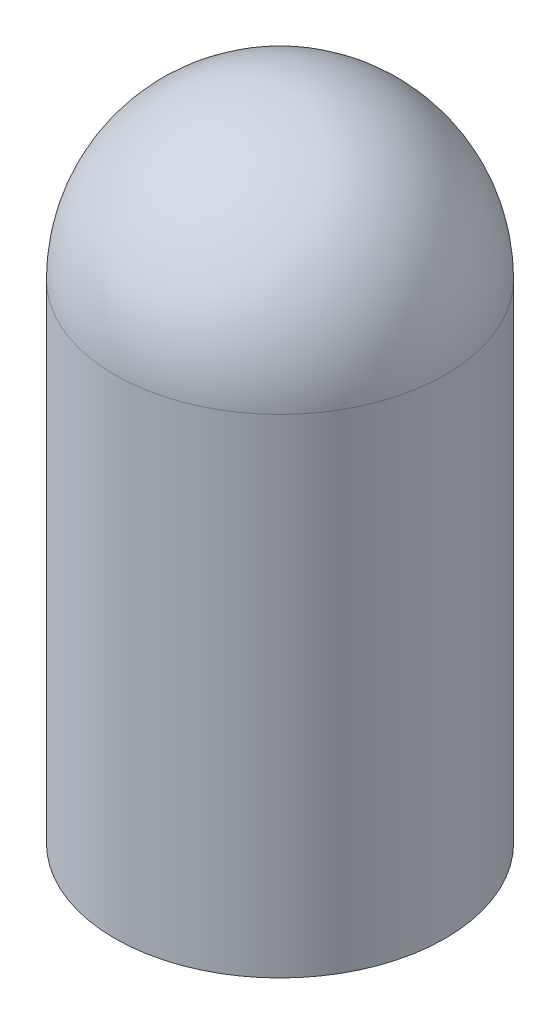
ISO-10303-21;
HEADER;
FILE_DESCRIPTION(('STEP AP214'),'2;1');
FILE_NAME('part.step','',(''),(''),'','','');
FILE_SCHEMA(('AUTOMOTIVE_DESIGN { 1 0 10303 214 1 1 1 1 }'));
ENDSEC;
DATA;
#1=APPLICATION_CONTEXT('core data for automotive mechanical design processes');
#2=APPLICATION_PROTOCOL_DEFINITION('international standard','automotive_design',2000,#1);
#3=PRODUCT_CONTEXT('',#1,'mechanical');
#4=PRODUCT('Part','Part','',(#3));
#5=PRODUCT_RELATED_PRODUCT_CATEGORY('part','',(#4));
#6=PRODUCT_DEFINITION_FORMATION('','',#4);
#7=PRODUCT_DEFINITION_CONTEXT('part definition',#1,'design');
#8=PRODUCT_DEFINITION('design','',#6,#7);
#9=PRODUCT_DEFINITION_SHAPE('','',#8);
#10=(LENGTH_UNIT() NAMED_UNIT(*) SI_UNIT(.MILLI.,.METRE.));
#11=(NAMED_UNIT(*) PLANE_ANGLE_UNIT() SI_UNIT($,.RADIAN.));
#12=(NAMED_UNIT(*) SI_UNIT($,.STERADIAN.) SOLID_ANGLE_UNIT());
#13=UNCERTAINTY_MEASURE_WITH_UNIT(LENGTH_MEASURE(1.E-05),#10,'distance_accuracy_value','');
#14=(GEOMETRIC_REPRESENTATION_CONTEXT(3) GLOBAL_UNCERTAINTY_ASSIGNED_CONTEXT((#13)) GLOBAL_UNIT_ASSIGNED_CONTEXT((#10,
#11,#12)) REPRESENTATION_CONTEXT('',''));
#15=CARTESIAN_POINT('',(0.,0.,0.));
#16=DIRECTION('',(0.,0.,1.));
#17=DIRECTION('',(1.,0.,0.));
#18=AXIS2_PLACEMENT_3D('',#15,#16,#17);
#19=CARTESIAN_POINT('',(-50.7999999999999,111.397142857143,0.));
#20=DIRECTION('',(0.,1.,0.));
#21=DIRECTION('',(-1.,0.,0.));
#22=AXIS2_PLACEMENT_3D('',#19,#20,#21);
#23=SPHERICAL_SURFACE('',#22,55.88);
#24=CARTESIAN_POINT('',(-50.7999999999999,111.397142857143,0.));
#25=DIRECTION('',(0.,1.,0.));
#26=DIRECTION('',(-1.,0.,0.));
#27=AXIS2_PLACEMENT_3D('',#24,#25,#26);
#28=CIRCLE('',#27,55.88);
#29=CARTESIAN_POINT('',(-106.68,111.397142857143,0.));
#30=VERTEX_POINT('',#29);
#31=EDGE_CURVE('E10',#30,#30,#28,.T.);
#32=ORIENTED_EDGE('',*,*,#31,.T.);
#33=EDGE_LOOP('',(#32));
#34=FACE_BOUND('',#33,.T.);
#35=ADVANCED_FACE('F33',(#34),#23,.T.);
#36=CARTESIAN_POINT('',(-50.7999999999999,162.197142857143,0.));
#37=DIRECTION('',(0.,1.,0.));
#38=DIRECTION('',(-1.,0.,0.));
#39=AXIS2_PLACEMENT_3D('',#36,#37,#38);
#40=CYLINDRICAL_SURFACE('',#39,55.88);
#41=CARTESIAN_POINT('',(-50.7999999999999,-53.7028571428571,0.));
#42=DIRECTION('',(0.,1.,0.));
#43=DIRECTION('',(-1.,0.,0.));
#44=AXIS2_PLACEMENT_3D('',#41,#42,#43);
#45=CIRCLE('',#44,55.88);
#46=CARTESIAN_POINT('',(-106.68,-53.7028571428571,0.));
#47=VERTEX_POINT('',#46);
#48=EDGE_CURVE('E37',#47,#47,#45,.T.);
#49=ORIENTED_EDGE('',*,*,#48,.T.);
#50=EDGE_LOOP('',(#49));
#51=FACE_BOUND('',#50,.T.);
#52=ORIENTED_EDGE('',*,*,#31,.F.);
#53=EDGE_LOOP('',(#52));
#54=FACE_BOUND('',#53,.T.);
#55=ADVANCED_FACE('F35',(#51,#54),#40,.T.);
#56=CARTESIAN_POINT('',(0.,-53.7028571428571,0.));
#57=DIRECTION('',(0.,1.,0.));
#58=DIRECTION('',(-1.,0.,0.));
#59=AXIS2_PLACEMENT_3D('',#56,#57,#58);
#60=PLANE('',#59);
#61=CARTESIAN_POINT('',(-50.7999999999999,-53.7028571428571,0.));
#62=DIRECTION('',(0.,1.,0.));
#63=DIRECTION('',(-1.,0.,0.));
#64=AXIS2_PLACEMENT_3D('',#61,#62,#63);
#65=CIRCLE('',#64,50.8);
#66=CARTESIAN_POINT('',(-101.6,-53.7028571428571,0.));
#67=VERTEX_POINT('',#66);
#68=EDGE_CURVE('E48',#67,#67,#65,.T.);
#69=ORIENTED_EDGE('',*,*,#68,.T.);
#70=EDGE_LOOP('',(#69));
#71=FACE_BOUND('',#70,.T.);
#72=ORIENTED_EDGE('',*,*,#48,.F.);
#73=EDGE_LOOP('',(#72));
#74=FACE_BOUND('',#73,.T.);
#75=ADVANCED_FACE('F52',(#71,#74),#60,.F.);
#76=CARTESIAN_POINT('',(-50.7999999999999,111.397142857143,0.));
#77=DIRECTION('',(0.,1.,0.));
#78=DIRECTION('',(-1.,0.,0.));
#79=AXIS2_PLACEMENT_3D('',#76,#77,#78);
#80=SPHERICAL_SURFACE('',#79,50.8);
#81=CARTESIAN_POINT('',(-50.7999999999999,111.397142857143,0.));
#82=DIRECTION('',(0.,1.,0.));
#83=DIRECTION('',(-1.,0.,0.));
#84=AXIS2_PLACEMENT_3D('',#81,#82,#83);
#85=CIRCLE('',#84,50.8);
#86=CARTESIAN_POINT('',(-101.6,111.397142857143,0.));
#87=VERTEX_POINT('',#86);
#88=EDGE_CURVE('E44',#87,#87,#85,.T.);
#89=ORIENTED_EDGE('',*,*,#88,.F.);
#90=EDGE_LOOP('',(#89));
#91=FACE_BOUND('',#90,.T.);
#92=ADVANCED_FACE('F58',(#91),#80,.F.);
#93=CARTESIAN_POINT('',(-50.7999999999999,162.197142857143,0.));
#94=DIRECTION('',(0.,1.,0.));
#95=DIRECTION('',(-1.,0.,0.));
#96=AXIS2_PLACEMENT_3D('',#93,#94,#95);
#97=CYLINDRICAL_SURFACE('',#96,50.8);
#98=ORIENTED_EDGE('',*,*,#68,.F.);
#99=EDGE_LOOP('',(#98));
#100=FACE_BOUND('',#99,.T.);
#101=ORIENTED_EDGE('',*,*,#88,.T.);
#102=EDGE_LOOP('',(#101));
#103=FACE_BOUND('',#102,.T.);
#104=ADVANCED_FACE('F55',(#100,#103),#97,.F.);
#105=CLOSED_SHELL('',(#35,#55,#75,#92,#104));
#106=MANIFOLD_SOLID_BREP('B2',#105);
#107=ADVANCED_BREP_SHAPE_REPRESENTATION('',(#18,#106),#14);
#108=SHAPE_DEFINITION_REPRESENTATION(#9,#107);
ENDSEC;
END-ISO-10303-21;
